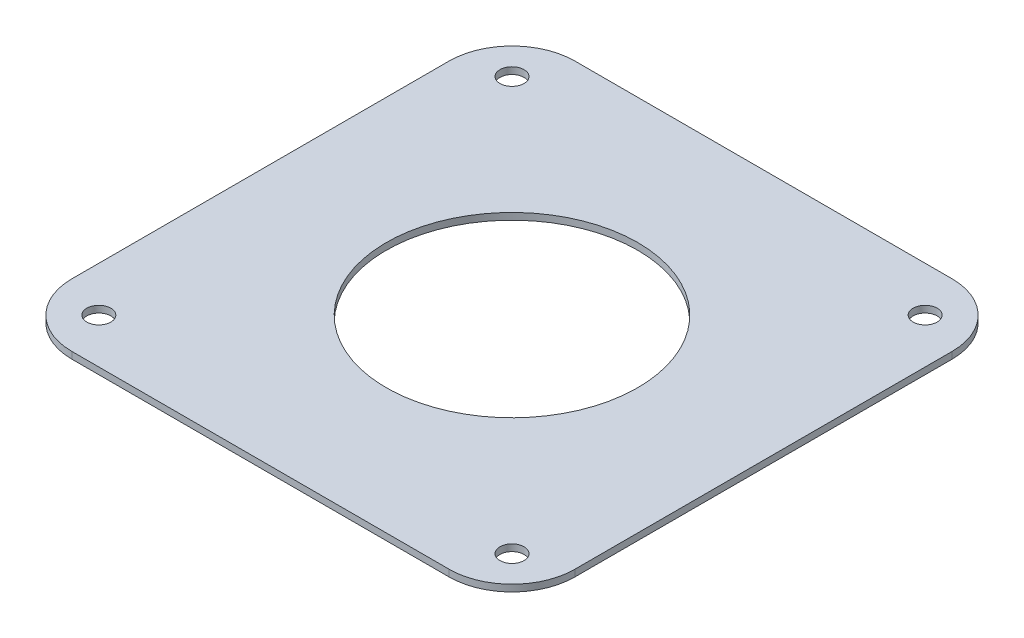
ISO-10303-21;
HEADER;
FILE_DESCRIPTION(('STEP AP214'),'2;1');
FILE_NAME('part.step','',(''),(''),'','','');
FILE_SCHEMA(('AUTOMOTIVE_DESIGN { 1 0 10303 214 1 1 1 1 }'));
ENDSEC;
DATA;
#1=APPLICATION_CONTEXT('core data for automotive mechanical design processes');
#2=APPLICATION_PROTOCOL_DEFINITION('international standard','automotive_design',2000,#1);
#3=PRODUCT_CONTEXT('',#1,'mechanical');
#4=PRODUCT('Part','Part','',(#3));
#5=PRODUCT_RELATED_PRODUCT_CATEGORY('part','',(#4));
#6=PRODUCT_DEFINITION_FORMATION('','',#4);
#7=PRODUCT_DEFINITION_CONTEXT('part definition',#1,'design');
#8=PRODUCT_DEFINITION('design','',#6,#7);
#9=PRODUCT_DEFINITION_SHAPE('','',#8);
#10=(LENGTH_UNIT() NAMED_UNIT(*) SI_UNIT(.MILLI.,.METRE.));
#11=(NAMED_UNIT(*) PLANE_ANGLE_UNIT() SI_UNIT($,.RADIAN.));
#12=(NAMED_UNIT(*) SI_UNIT($,.STERADIAN.) SOLID_ANGLE_UNIT());
#13=UNCERTAINTY_MEASURE_WITH_UNIT(LENGTH_MEASURE(1.E-05),#10,'distance_accuracy_value','');
#14=(GEOMETRIC_REPRESENTATION_CONTEXT(3) GLOBAL_UNCERTAINTY_ASSIGNED_CONTEXT((#13)) GLOBAL_UNIT_ASSIGNED_CONTEXT((#10,
#11,#12)) REPRESENTATION_CONTEXT('',''));
#15=CARTESIAN_POINT('',(0.,0.,0.));
#16=DIRECTION('',(0.,0.,1.));
#17=DIRECTION('',(1.,0.,0.));
#18=AXIS2_PLACEMENT_3D('',#15,#16,#17);
#19=CARTESIAN_POINT('',(0.,0.9525,0.));
#20=DIRECTION('',(0.,1.,0.));
#21=DIRECTION('',(0.,0.,1.));
#22=AXIS2_PLACEMENT_3D('',#19,#20,#21);
#23=PLANE('',#22);
#24=CARTESIAN_POINT('',(-29.21,0.9525,29.21));
#25=DIRECTION('',(0.,1.,0.));
#26=DIRECTION('',(0.,0.,1.));
#27=AXIS2_PLACEMENT_3D('',#24,#25,#26);
#28=CIRCLE('',#27,1.7);
#29=CARTESIAN_POINT('',(-29.21,0.9525,30.91));
#30=VERTEX_POINT('',#29);
#31=EDGE_CURVE('E203',#30,#30,#28,.T.);
#32=ORIENTED_EDGE('',*,*,#31,.F.);
#33=EDGE_LOOP('',(#32));
#34=FACE_BOUND('',#33,.T.);
#35=CARTESIAN_POINT('',(29.21,0.9525,29.21));
#36=DIRECTION('',(0.,1.,0.));
#37=DIRECTION('',(0.,0.,1.));
#38=AXIS2_PLACEMENT_3D('',#35,#36,#37);
#39=CIRCLE('',#38,1.7);
#40=CARTESIAN_POINT('',(29.21,0.9525,30.91));
#41=VERTEX_POINT('',#40);
#42=EDGE_CURVE('E197',#41,#41,#39,.T.);
#43=ORIENTED_EDGE('',*,*,#42,.F.);
#44=EDGE_LOOP('',(#43));
#45=FACE_BOUND('',#44,.T.);
#46=CARTESIAN_POINT('',(29.21,0.9525,-29.21));
#47=DIRECTION('',(0.,1.,0.));
#48=DIRECTION('',(0.,0.,1.));
#49=AXIS2_PLACEMENT_3D('',#46,#47,#48);
#50=CIRCLE('',#49,1.7);
#51=CARTESIAN_POINT('',(29.21,0.9525,-27.51));
#52=VERTEX_POINT('',#51);
#53=EDGE_CURVE('E191',#52,#52,#50,.T.);
#54=ORIENTED_EDGE('',*,*,#53,.F.);
#55=EDGE_LOOP('',(#54));
#56=FACE_BOUND('',#55,.T.);
#57=CARTESIAN_POINT('',(-29.21,0.9525,-29.21));
#58=DIRECTION('',(0.,1.,0.));
#59=DIRECTION('',(0.,0.,1.));
#60=AXIS2_PLACEMENT_3D('',#57,#58,#59);
#61=CIRCLE('',#60,1.7);
#62=CARTESIAN_POINT('',(-29.21,0.9525,-27.51));
#63=VERTEX_POINT('',#62);
#64=EDGE_CURVE('E185',#63,#63,#61,.T.);
#65=ORIENTED_EDGE('',*,*,#64,.F.);
#66=EDGE_LOOP('',(#65));
#67=FACE_BOUND('',#66,.T.);
#68=DIRECTION('',(0.,0.,-1.));
#69=VECTOR('',#68,1.);
#70=CARTESIAN_POINT('',(35.56,0.9525,-35.56));
#71=LINE('',#70,#69);
#72=CARTESIAN_POINT('',(35.56,0.9525,26.67));
#73=VERTEX_POINT('',#72);
#74=CARTESIAN_POINT('',(35.56,0.9525,-26.67));
#75=VERTEX_POINT('',#74);
#76=EDGE_CURVE('E137',#73,#75,#71,.T.);
#77=ORIENTED_EDGE('',*,*,#76,.T.);
#78=CARTESIAN_POINT('',(26.67,0.9525,-26.67));
#79=DIRECTION('',(0.,1.,0.));
#80=DIRECTION('',(0.,0.,1.));
#81=AXIS2_PLACEMENT_3D('',#78,#79,#80);
#82=CIRCLE('',#81,8.89);
#83=CARTESIAN_POINT('',(26.67,0.9525,-35.56));
#84=VERTEX_POINT('',#83);
#85=EDGE_CURVE('E152',#75,#84,#82,.T.);
#86=ORIENTED_EDGE('',*,*,#85,.T.);
#87=DIRECTION('',(-1.,0.,0.));
#88=VECTOR('',#87,1.);
#89=CARTESIAN_POINT('',(-35.56,0.9525,-35.56));
#90=LINE('',#89,#88);
#91=CARTESIAN_POINT('',(-26.67,0.9525,-35.56));
#92=VERTEX_POINT('',#91);
#93=EDGE_CURVE('E119',#84,#92,#90,.T.);
#94=ORIENTED_EDGE('',*,*,#93,.T.);
#95=CARTESIAN_POINT('',(-26.67,0.9525,-26.67));
#96=DIRECTION('',(0.,1.,0.));
#97=DIRECTION('',(0.,0.,1.));
#98=AXIS2_PLACEMENT_3D('',#95,#96,#97);
#99=CIRCLE('',#98,8.89);
#100=CARTESIAN_POINT('',(-35.56,0.9525,-26.67));
#101=VERTEX_POINT('',#100);
#102=EDGE_CURVE('E150',#92,#101,#99,.T.);
#103=ORIENTED_EDGE('',*,*,#102,.T.);
#104=DIRECTION('',(0.,0.,1.));
#105=VECTOR('',#104,1.);
#106=CARTESIAN_POINT('',(-35.56,0.9525,-35.56));
#107=LINE('',#106,#105);
#108=CARTESIAN_POINT('',(-35.56,0.9525,26.67));
#109=VERTEX_POINT('',#108);
#110=EDGE_CURVE('E163',#101,#109,#107,.T.);
#111=ORIENTED_EDGE('',*,*,#110,.T.);
#112=CARTESIAN_POINT('',(-26.67,0.9525,26.67));
#113=DIRECTION('',(0.,1.,0.));
#114=DIRECTION('',(0.,0.,1.));
#115=AXIS2_PLACEMENT_3D('',#112,#113,#114);
#116=CIRCLE('',#115,8.89);
#117=CARTESIAN_POINT('',(-26.67,0.9525,35.56));
#118=VERTEX_POINT('',#117);
#119=EDGE_CURVE('E54',#109,#118,#116,.T.);
#120=ORIENTED_EDGE('',*,*,#119,.T.);
#121=DIRECTION('',(1.,0.,0.));
#122=VECTOR('',#121,1.);
#123=CARTESIAN_POINT('',(-35.56,0.9525,35.56));
#124=LINE('',#123,#122);
#125=CARTESIAN_POINT('',(26.67,0.9525,35.56));
#126=VERTEX_POINT('',#125);
#127=EDGE_CURVE('E138',#118,#126,#124,.T.);
#128=ORIENTED_EDGE('',*,*,#127,.T.);
#129=CARTESIAN_POINT('',(26.67,0.9525,26.67));
#130=DIRECTION('',(0.,1.,0.));
#131=DIRECTION('',(0.,0.,1.));
#132=AXIS2_PLACEMENT_3D('',#129,#130,#131);
#133=CIRCLE('',#132,8.89);
#134=EDGE_CURVE('E147',#126,#73,#133,.T.);
#135=ORIENTED_EDGE('',*,*,#134,.T.);
#136=EDGE_LOOP('',(#77,#86,#94,#103,#111,#120,#128,#135));
#137=FACE_BOUND('',#136,.T.);
#138=CARTESIAN_POINT('',(0.,0.9525,0.));
#139=DIRECTION('',(0.,1.,0.));
#140=DIRECTION('',(0.,0.,1.));
#141=AXIS2_PLACEMENT_3D('',#138,#139,#140);
#142=CIRCLE('',#141,17.78);
#143=CARTESIAN_POINT('',(0.,0.9525,-17.78));
#144=VERTEX_POINT('',#143);
#145=EDGE_CURVE('E132',#144,#144,#142,.T.);
#146=ORIENTED_EDGE('',*,*,#145,.F.);
#147=EDGE_LOOP('',(#146));
#148=FACE_BOUND('',#147,.T.);
#149=ADVANCED_FACE('F33',(#34,#45,#56,#67,#137,#148),#23,.T.);
#150=CARTESIAN_POINT('',(0.,0.,0.));
#151=DIRECTION('',(0.,1.,0.));
#152=DIRECTION('',(0.,0.,1.));
#153=AXIS2_PLACEMENT_3D('',#150,#151,#152);
#154=PLANE('',#153);
#155=CARTESIAN_POINT('',(-29.21,0.,29.21));
#156=DIRECTION('',(0.,1.,0.));
#157=DIRECTION('',(0.,0.,1.));
#158=AXIS2_PLACEMENT_3D('',#155,#156,#157);
#159=CIRCLE('',#158,1.7);
#160=CARTESIAN_POINT('',(-29.21,0.,30.91));
#161=VERTEX_POINT('',#160);
#162=EDGE_CURVE('E200',#161,#161,#159,.T.);
#163=ORIENTED_EDGE('',*,*,#162,.T.);
#164=EDGE_LOOP('',(#163));
#165=FACE_BOUND('',#164,.T.);
#166=CARTESIAN_POINT('',(29.21,0.,29.21));
#167=DIRECTION('',(0.,1.,0.));
#168=DIRECTION('',(0.,0.,1.));
#169=AXIS2_PLACEMENT_3D('',#166,#167,#168);
#170=CIRCLE('',#169,1.7);
#171=CARTESIAN_POINT('',(29.21,0.,30.91));
#172=VERTEX_POINT('',#171);
#173=EDGE_CURVE('E194',#172,#172,#170,.T.);
#174=ORIENTED_EDGE('',*,*,#173,.T.);
#175=EDGE_LOOP('',(#174));
#176=FACE_BOUND('',#175,.T.);
#177=CARTESIAN_POINT('',(29.21,0.,-29.21));
#178=DIRECTION('',(0.,1.,0.));
#179=DIRECTION('',(0.,0.,1.));
#180=AXIS2_PLACEMENT_3D('',#177,#178,#179);
#181=CIRCLE('',#180,1.7);
#182=CARTESIAN_POINT('',(29.21,0.,-27.51));
#183=VERTEX_POINT('',#182);
#184=EDGE_CURVE('E188',#183,#183,#181,.T.);
#185=ORIENTED_EDGE('',*,*,#184,.T.);
#186=EDGE_LOOP('',(#185));
#187=FACE_BOUND('',#186,.T.);
#188=CARTESIAN_POINT('',(-29.21,0.,-29.21));
#189=DIRECTION('',(0.,1.,0.));
#190=DIRECTION('',(0.,0.,1.));
#191=AXIS2_PLACEMENT_3D('',#188,#189,#190);
#192=CIRCLE('',#191,1.7);
#193=CARTESIAN_POINT('',(-29.21,0.,-27.51));
#194=VERTEX_POINT('',#193);
#195=EDGE_CURVE('E180',#194,#194,#192,.T.);
#196=ORIENTED_EDGE('',*,*,#195,.T.);
#197=EDGE_LOOP('',(#196));
#198=FACE_BOUND('',#197,.T.);
#199=DIRECTION('',(-1.,0.,0.));
#200=VECTOR('',#199,1.);
#201=CARTESIAN_POINT('',(-35.56,0.,-35.56));
#202=LINE('',#201,#200);
#203=CARTESIAN_POINT('',(26.67,0.,-35.56));
#204=VERTEX_POINT('',#203);
#205=CARTESIAN_POINT('',(-26.67,0.,-35.56));
#206=VERTEX_POINT('',#205);
#207=EDGE_CURVE('E116',#204,#206,#202,.T.);
#208=ORIENTED_EDGE('',*,*,#207,.F.);
#209=CARTESIAN_POINT('',(26.67,0.,-26.67));
#210=DIRECTION('',(0.,1.,0.));
#211=DIRECTION('',(0.,0.,1.));
#212=AXIS2_PLACEMENT_3D('',#209,#210,#211);
#213=CIRCLE('',#212,8.89);
#214=CARTESIAN_POINT('',(35.56,0.,-26.67));
#215=VERTEX_POINT('',#214);
#216=EDGE_CURVE('E99',#204,#215,#213,.F.);
#217=ORIENTED_EDGE('',*,*,#216,.T.);
#218=DIRECTION('',(0.,0.,-1.));
#219=VECTOR('',#218,1.);
#220=CARTESIAN_POINT('',(35.56,0.,-35.56));
#221=LINE('',#220,#219);
#222=CARTESIAN_POINT('',(35.56,0.,26.67));
#223=VERTEX_POINT('',#222);
#224=EDGE_CURVE('E127',#223,#215,#221,.T.);
#225=ORIENTED_EDGE('',*,*,#224,.F.);
#226=CARTESIAN_POINT('',(26.67,0.,26.67));
#227=DIRECTION('',(0.,1.,0.));
#228=DIRECTION('',(0.,0.,1.));
#229=AXIS2_PLACEMENT_3D('',#226,#227,#228);
#230=CIRCLE('',#229,8.89);
#231=CARTESIAN_POINT('',(26.67,0.,35.56));
#232=VERTEX_POINT('',#231);
#233=EDGE_CURVE('E120',#223,#232,#230,.F.);
#234=ORIENTED_EDGE('',*,*,#233,.T.);
#235=DIRECTION('',(1.,0.,0.));
#236=VECTOR('',#235,1.);
#237=CARTESIAN_POINT('',(-35.56,0.,35.56));
#238=LINE('',#237,#236);
#239=CARTESIAN_POINT('',(-26.67,0.,35.56));
#240=VERTEX_POINT('',#239);
#241=EDGE_CURVE('E130',#240,#232,#238,.T.);
#242=ORIENTED_EDGE('',*,*,#241,.F.);
#243=CARTESIAN_POINT('',(-26.67,0.,26.67));
#244=DIRECTION('',(0.,1.,0.));
#245=DIRECTION('',(0.,0.,1.));
#246=AXIS2_PLACEMENT_3D('',#243,#244,#245);
#247=CIRCLE('',#246,8.89);
#248=CARTESIAN_POINT('',(-35.56,0.,26.67));
#249=VERTEX_POINT('',#248);
#250=EDGE_CURVE('E141',#240,#249,#247,.F.);
#251=ORIENTED_EDGE('',*,*,#250,.T.);
#252=DIRECTION('',(0.,0.,1.));
#253=VECTOR('',#252,1.);
#254=CARTESIAN_POINT('',(-35.56,0.,-35.56));
#255=LINE('',#254,#253);
#256=CARTESIAN_POINT('',(-35.56,0.,-26.67));
#257=VERTEX_POINT('',#256);
#258=EDGE_CURVE('E126',#257,#249,#255,.T.);
#259=ORIENTED_EDGE('',*,*,#258,.F.);
#260=CARTESIAN_POINT('',(-26.67,0.,-26.67));
#261=DIRECTION('',(0.,1.,0.));
#262=DIRECTION('',(0.,0.,1.));
#263=AXIS2_PLACEMENT_3D('',#260,#261,#262);
#264=CIRCLE('',#263,8.89);
#265=EDGE_CURVE('E110',#257,#206,#264,.F.);
#266=ORIENTED_EDGE('',*,*,#265,.T.);
#267=EDGE_LOOP('',(#208,#217,#225,#234,#242,#251,#259,#266));
#268=FACE_BOUND('',#267,.T.);
#269=CARTESIAN_POINT('',(0.,0.,0.));
#270=DIRECTION('',(0.,1.,0.));
#271=DIRECTION('',(0.,0.,1.));
#272=AXIS2_PLACEMENT_3D('',#269,#270,#271);
#273=CIRCLE('',#272,17.78);
#274=CARTESIAN_POINT('',(0.,0.,-17.78));
#275=VERTEX_POINT('',#274);
#276=EDGE_CURVE('E177',#275,#275,#273,.T.);
#277=ORIENTED_EDGE('',*,*,#276,.T.);
#278=EDGE_LOOP('',(#277));
#279=FACE_BOUND('',#278,.T.);
#280=ADVANCED_FACE('F123',(#165,#176,#187,#198,#268,#279),#154,.F.);
#281=CARTESIAN_POINT('',(35.56,0.9525,-35.56));
#282=DIRECTION('',(-1.,0.,0.));
#283=DIRECTION('',(0.,0.,1.));
#284=AXIS2_PLACEMENT_3D('',#281,#282,#283);
#285=PLANE('',#284);
#286=ORIENTED_EDGE('',*,*,#224,.T.);
#287=DIRECTION('',(0.,-1.,0.));
#288=VECTOR('',#287,1.);
#289=CARTESIAN_POINT('',(35.56,0.9525,-26.67));
#290=LINE('',#289,#288);
#291=EDGE_CURVE('E104',#215,#75,#290,.F.);
#292=ORIENTED_EDGE('',*,*,#291,.T.);
#293=ORIENTED_EDGE('',*,*,#76,.F.);
#294=DIRECTION('',(0.,-1.,0.));
#295=VECTOR('',#294,1.);
#296=CARTESIAN_POINT('',(35.56,0.9525,26.67));
#297=LINE('',#296,#295);
#298=EDGE_CURVE('E109',#73,#223,#297,.T.);
#299=ORIENTED_EDGE('',*,*,#298,.T.);
#300=EDGE_LOOP('',(#286,#292,#293,#299));
#301=FACE_BOUND('',#300,.T.);
#302=ADVANCED_FACE('F227',(#301),#285,.F.);
#303=CARTESIAN_POINT('',(-35.56,0.9525,-35.56));
#304=DIRECTION('',(0.,0.,1.));
#305=DIRECTION('',(1.,0.,0.));
#306=AXIS2_PLACEMENT_3D('',#303,#304,#305);
#307=PLANE('',#306);
#308=ORIENTED_EDGE('',*,*,#93,.F.);
#309=DIRECTION('',(0.,-1.,0.));
#310=VECTOR('',#309,1.);
#311=CARTESIAN_POINT('',(26.67,0.9525,-35.56));
#312=LINE('',#311,#310);
#313=EDGE_CURVE('E103',#84,#204,#312,.T.);
#314=ORIENTED_EDGE('',*,*,#313,.T.);
#315=ORIENTED_EDGE('',*,*,#207,.T.);
#316=DIRECTION('',(0.,-1.,0.));
#317=VECTOR('',#316,1.);
#318=CARTESIAN_POINT('',(-26.67,0.9525,-35.56));
#319=LINE('',#318,#317);
#320=EDGE_CURVE('E121',#206,#92,#319,.F.);
#321=ORIENTED_EDGE('',*,*,#320,.T.);
#322=EDGE_LOOP('',(#308,#314,#315,#321));
#323=FACE_BOUND('',#322,.T.);
#324=ADVANCED_FACE('F115',(#323),#307,.F.);
#325=CARTESIAN_POINT('',(-35.56,0.9525,-35.56));
#326=DIRECTION('',(1.,0.,0.));
#327=DIRECTION('',(0.,0.,-1.));
#328=AXIS2_PLACEMENT_3D('',#325,#326,#327);
#329=PLANE('',#328);
#330=ORIENTED_EDGE('',*,*,#110,.F.);
#331=DIRECTION('',(0.,-1.,0.));
#332=VECTOR('',#331,1.);
#333=CARTESIAN_POINT('',(-35.56,0.9525,-26.67));
#334=LINE('',#333,#332);
#335=EDGE_CURVE('E156',#101,#257,#334,.T.);
#336=ORIENTED_EDGE('',*,*,#335,.T.);
#337=ORIENTED_EDGE('',*,*,#258,.T.);
#338=DIRECTION('',(0.,-1.,0.));
#339=VECTOR('',#338,1.);
#340=CARTESIAN_POINT('',(-35.56,0.9525,26.67));
#341=LINE('',#340,#339);
#342=EDGE_CURVE('E154',#249,#109,#341,.F.);
#343=ORIENTED_EDGE('',*,*,#342,.T.);
#344=EDGE_LOOP('',(#330,#336,#337,#343));
#345=FACE_BOUND('',#344,.T.);
#346=ADVANCED_FACE('F161',(#345),#329,.F.);
#347=CARTESIAN_POINT('',(-35.56,0.9525,35.56));
#348=DIRECTION('',(0.,0.,-1.));
#349=DIRECTION('',(-1.,0.,0.));
#350=AXIS2_PLACEMENT_3D('',#347,#348,#349);
#351=PLANE('',#350);
#352=ORIENTED_EDGE('',*,*,#127,.F.);
#353=DIRECTION('',(0.,-1.,0.));
#354=VECTOR('',#353,1.);
#355=CARTESIAN_POINT('',(-26.67,0.9525,35.56));
#356=LINE('',#355,#354);
#357=EDGE_CURVE('E11',#118,#240,#356,.T.);
#358=ORIENTED_EDGE('',*,*,#357,.T.);
#359=ORIENTED_EDGE('',*,*,#241,.T.);
#360=DIRECTION('',(0.,-1.,0.));
#361=VECTOR('',#360,1.);
#362=CARTESIAN_POINT('',(26.67,0.9525,35.56));
#363=LINE('',#362,#361);
#364=EDGE_CURVE('E41',#232,#126,#363,.F.);
#365=ORIENTED_EDGE('',*,*,#364,.T.);
#366=EDGE_LOOP('',(#352,#358,#359,#365));
#367=FACE_BOUND('',#366,.T.);
#368=ADVANCED_FACE('F170',(#367),#351,.F.);
#369=CARTESIAN_POINT('',(0.,0.9525,0.));
#370=DIRECTION('',(0.,-1.,0.));
#371=DIRECTION('',(0.,0.,-1.));
#372=AXIS2_PLACEMENT_3D('',#369,#370,#371);
#373=CYLINDRICAL_SURFACE('',#372,17.78);
#374=CARTESIAN_POINT('',(0.,0.9525,-17.78));
#375=CARTESIAN_POINT('',(0.,0.942578125,-17.78));
#376=CARTESIAN_POINT('',(0.,0.93265625,-17.78));
#377=CARTESIAN_POINT('',(0.,0.9128125,-17.78));
#378=CARTESIAN_POINT('',(0.,0.902890625,-17.78));
#379=CARTESIAN_POINT('',(0.,0.883046875,-17.78));
#380=CARTESIAN_POINT('',(0.,0.873125,-17.78));
#381=CARTESIAN_POINT('',(0.,0.85328125,-17.78));
#382=CARTESIAN_POINT('',(0.,0.843359375,-17.78));
#383=CARTESIAN_POINT('',(0.,0.823515625,-17.78));
#384=CARTESIAN_POINT('',(0.,0.81359375,-17.78));
#385=CARTESIAN_POINT('',(0.,0.79375,-17.78));
#386=CARTESIAN_POINT('',(0.,0.783828125,-17.78));
#387=CARTESIAN_POINT('',(0.,0.763984375,-17.78));
#388=CARTESIAN_POINT('',(0.,0.7540625,-17.78));
#389=CARTESIAN_POINT('',(0.,0.73421875,-17.78));
#390=CARTESIAN_POINT('',(0.,0.724296875,-17.78));
#391=CARTESIAN_POINT('',(0.,0.704453125,-17.78));
#392=CARTESIAN_POINT('',(0.,0.69453125,-17.78));
#393=CARTESIAN_POINT('',(0.,0.6746875,-17.78));
#394=CARTESIAN_POINT('',(0.,0.664765625,-17.78));
#395=CARTESIAN_POINT('',(0.,0.644921875,-17.78));
#396=CARTESIAN_POINT('',(0.,0.635,-17.78));
#397=CARTESIAN_POINT('',(0.,0.61515625,-17.78));
#398=CARTESIAN_POINT('',(0.,0.605234375,-17.78));
#399=CARTESIAN_POINT('',(0.,0.585390625,-17.78));
#400=CARTESIAN_POINT('',(0.,0.57546875,-17.78));
#401=CARTESIAN_POINT('',(0.,0.555625,-17.78));
#402=CARTESIAN_POINT('',(0.,0.545703125,-17.78));
#403=CARTESIAN_POINT('',(0.,0.525859375,-17.78));
#404=CARTESIAN_POINT('',(0.,0.5159375,-17.78));
#405=CARTESIAN_POINT('',(0.,0.49609375,-17.78));
#406=CARTESIAN_POINT('',(0.,0.486171875,-17.78));
#407=CARTESIAN_POINT('',(0.,0.466328125,-17.78));
#408=CARTESIAN_POINT('',(0.,0.45640625,-17.78));
#409=CARTESIAN_POINT('',(0.,0.4365625,-17.78));
#410=CARTESIAN_POINT('',(0.,0.426640625,-17.78));
#411=CARTESIAN_POINT('',(0.,0.406796875,-17.78));
#412=CARTESIAN_POINT('',(0.,0.396875,-17.78));
#413=CARTESIAN_POINT('',(0.,0.37703125,-17.78));
#414=CARTESIAN_POINT('',(0.,0.367109375,-17.78));
#415=CARTESIAN_POINT('',(0.,0.347265625,-17.78));
#416=CARTESIAN_POINT('',(0.,0.33734375,-17.78));
#417=CARTESIAN_POINT('',(0.,0.3175,-17.78));
#418=CARTESIAN_POINT('',(0.,0.307578125,-17.78));
#419=CARTESIAN_POINT('',(0.,0.287734375,-17.78));
#420=CARTESIAN_POINT('',(0.,0.2778125,-17.78));
#421=CARTESIAN_POINT('',(0.,0.25796875,-17.78));
#422=CARTESIAN_POINT('',(0.,0.248046875,-17.78));
#423=CARTESIAN_POINT('',(0.,0.228203125,-17.78));
#424=CARTESIAN_POINT('',(0.,0.21828125,-17.78));
#425=CARTESIAN_POINT('',(0.,0.1984375,-17.78));
#426=CARTESIAN_POINT('',(0.,0.188515625,-17.78));
#427=CARTESIAN_POINT('',(0.,0.168671875,-17.78));
#428=CARTESIAN_POINT('',(0.,0.15875,-17.78));
#429=CARTESIAN_POINT('',(0.,0.13890625,-17.78));
#430=CARTESIAN_POINT('',(0.,0.128984375,-17.78));
#431=CARTESIAN_POINT('',(0.,0.109140625,-17.78));
#432=CARTESIAN_POINT('',(0.,0.09921875,-17.78));
#433=CARTESIAN_POINT('',(0.,0.079375,-17.78));
#434=CARTESIAN_POINT('',(0.,0.069453125,-17.78));
#435=CARTESIAN_POINT('',(0.,0.049609375,-17.78));
#436=CARTESIAN_POINT('',(0.,0.0396875,-17.78));
#437=CARTESIAN_POINT('',(0.,0.01984375,-17.78));
#438=CARTESIAN_POINT('',(0.,0.00992187499999998,-17.78));
#439=CARTESIAN_POINT('',(0.,0.,-17.78));
#440=B_SPLINE_CURVE_WITH_KNOTS('',3,(#374,#375,#376,#377,#378,#379,#380,#381,#382,#383,#384,
#385,#386,#387,#388,#389,#390,#391,#392,#393,#394,#395,#396,#397,#398,#399,#400,#401,#402,#403,
#404,#405,#406,#407,#408,#409,#410,#411,#412,#413,#414,#415,#416,#417,#418,#419,#420,#421,#422,
#423,#424,#425,#426,#427,#428,#429,#430,#431,#432,#433,#434,#435,#436,#437,#438,#439),
.UNSPECIFIED.,.F.,.F.,(4,2,2,2,2,2,2,2,2,2,2,2,2,2,2,2,2,2,2,2,2,2,2,2,2,2,2,2,2,2,2,2,4),(0.,
0.0297656250000001,0.05953125,0.0892968750000001,0.1190625,0.148828125,0.17859375,0.208359375,
0.238125,0.267890625,0.29765625,0.327421875,0.3571875,0.386953125,0.41671875,0.446484375,
0.47625,0.506015625,0.53578125,0.565546875,0.5953125,0.625078125,0.65484375,0.684609375,
0.714375,0.744140625,0.77390625,0.803671875,0.8334375,0.863203125,0.89296875,0.922734375,
0.9525),.UNSPECIFIED.);
#441=EDGE_CURVE('BSEAM221',#144,#275,#440,.T.);
#442=ORIENTED_EDGE('',*,*,#145,.T.);
#443=ORIENTED_EDGE('',*,*,#276,.F.);
#444=ORIENTED_EDGE('',*,*,#441,.T.);
#445=ORIENTED_EDGE('',*,*,#441,.F.);
#446=EDGE_LOOP('',(#442,#444,#443,#445));
#447=FACE_BOUND('',#446,.T.);
#448=ADVANCED_FACE('F221',(#447),#373,.F.);
#449=CARTESIAN_POINT('',(26.67,0.9525,-26.67));
#450=DIRECTION('',(0.,-1.,0.));
#451=DIRECTION('',(0.,0.,-1.));
#452=AXIS2_PLACEMENT_3D('',#449,#450,#451);
#453=CYLINDRICAL_SURFACE('',#452,8.89);
#454=ORIENTED_EDGE('',*,*,#85,.F.);
#455=ORIENTED_EDGE('',*,*,#291,.F.);
#456=ORIENTED_EDGE('',*,*,#216,.F.);
#457=ORIENTED_EDGE('',*,*,#313,.F.);
#458=EDGE_LOOP('',(#454,#455,#456,#457));
#459=FACE_BOUND('',#458,.T.);
#460=ADVANCED_FACE('F102',(#459),#453,.T.);
#461=CARTESIAN_POINT('',(-26.67,0.9525,-26.67));
#462=DIRECTION('',(0.,-1.,0.));
#463=DIRECTION('',(0.,0.,-1.));
#464=AXIS2_PLACEMENT_3D('',#461,#462,#463);
#465=CYLINDRICAL_SURFACE('',#464,8.89);
#466=ORIENTED_EDGE('',*,*,#102,.F.);
#467=ORIENTED_EDGE('',*,*,#320,.F.);
#468=ORIENTED_EDGE('',*,*,#265,.F.);
#469=ORIENTED_EDGE('',*,*,#335,.F.);
#470=EDGE_LOOP('',(#466,#467,#468,#469));
#471=FACE_BOUND('',#470,.T.);
#472=ADVANCED_FACE('F245',(#471),#465,.T.);
#473=CARTESIAN_POINT('',(-26.67,0.9525,26.67));
#474=DIRECTION('',(0.,-1.,0.));
#475=DIRECTION('',(0.,0.,-1.));
#476=AXIS2_PLACEMENT_3D('',#473,#474,#475);
#477=CYLINDRICAL_SURFACE('',#476,8.89);
#478=ORIENTED_EDGE('',*,*,#119,.F.);
#479=ORIENTED_EDGE('',*,*,#342,.F.);
#480=ORIENTED_EDGE('',*,*,#250,.F.);
#481=ORIENTED_EDGE('',*,*,#357,.F.);
#482=EDGE_LOOP('',(#478,#479,#480,#481));
#483=FACE_BOUND('',#482,.T.);
#484=ADVANCED_FACE('F169',(#483),#477,.T.);
#485=CARTESIAN_POINT('',(26.67,0.9525,26.67));
#486=DIRECTION('',(0.,-1.,0.));
#487=DIRECTION('',(0.,0.,-1.));
#488=AXIS2_PLACEMENT_3D('',#485,#486,#487);
#489=CYLINDRICAL_SURFACE('',#488,8.89);
#490=ORIENTED_EDGE('',*,*,#134,.F.);
#491=ORIENTED_EDGE('',*,*,#364,.F.);
#492=ORIENTED_EDGE('',*,*,#233,.F.);
#493=ORIENTED_EDGE('',*,*,#298,.F.);
#494=EDGE_LOOP('',(#490,#491,#492,#493));
#495=FACE_BOUND('',#494,.T.);
#496=ADVANCED_FACE('F35',(#495),#489,.T.);
#497=CARTESIAN_POINT('',(-29.21,0.9525,-29.21));
#498=DIRECTION('',(0.,1.,0.));
#499=DIRECTION('',(0.,0.,1.));
#500=AXIS2_PLACEMENT_3D('',#497,#498,#499);
#501=CYLINDRICAL_SURFACE('',#500,1.7);
#502=ORIENTED_EDGE('',*,*,#195,.F.);
#503=EDGE_LOOP('',(#502));
#504=FACE_BOUND('',#503,.T.);
#505=ORIENTED_EDGE('',*,*,#64,.T.);
#506=EDGE_LOOP('',(#505));
#507=FACE_BOUND('',#506,.T.);
#508=ADVANCED_FACE('F251',(#504,#507),#501,.F.);
#509=CARTESIAN_POINT('',(29.21,0.9525,-29.21));
#510=DIRECTION('',(0.,1.,0.));
#511=DIRECTION('',(0.,0.,1.));
#512=AXIS2_PLACEMENT_3D('',#509,#510,#511);
#513=CYLINDRICAL_SURFACE('',#512,1.7);
#514=ORIENTED_EDGE('',*,*,#184,.F.);
#515=EDGE_LOOP('',(#514));
#516=FACE_BOUND('',#515,.T.);
#517=ORIENTED_EDGE('',*,*,#53,.T.);
#518=EDGE_LOOP('',(#517));
#519=FACE_BOUND('',#518,.T.);
#520=ADVANCED_FACE('F256',(#516,#519),#513,.F.);
#521=CARTESIAN_POINT('',(29.21,0.9525,29.21));
#522=DIRECTION('',(0.,1.,0.));
#523=DIRECTION('',(0.,0.,1.));
#524=AXIS2_PLACEMENT_3D('',#521,#522,#523);
#525=CYLINDRICAL_SURFACE('',#524,1.7);
#526=ORIENTED_EDGE('',*,*,#173,.F.);
#527=EDGE_LOOP('',(#526));
#528=FACE_BOUND('',#527,.T.);
#529=ORIENTED_EDGE('',*,*,#42,.T.);
#530=EDGE_LOOP('',(#529));
#531=FACE_BOUND('',#530,.T.);
#532=ADVANCED_FACE('F263',(#528,#531),#525,.F.);
#533=CARTESIAN_POINT('',(-29.21,0.9525,29.21));
#534=DIRECTION('',(0.,1.,0.));
#535=DIRECTION('',(0.,0.,1.));
#536=AXIS2_PLACEMENT_3D('',#533,#534,#535);
#537=CYLINDRICAL_SURFACE('',#536,1.7);
#538=ORIENTED_EDGE('',*,*,#162,.F.);
#539=EDGE_LOOP('',(#538));
#540=FACE_BOUND('',#539,.T.);
#541=ORIENTED_EDGE('',*,*,#31,.T.);
#542=EDGE_LOOP('',(#541));
#543=FACE_BOUND('',#542,.T.);
#544=ADVANCED_FACE('F207',(#540,#543),#537,.F.);
#545=CLOSED_SHELL('',(#149,#280,#302,#324,#346,#368,#448,#460,#472,#484,#496,#508,#520,#532,#544));
#546=MANIFOLD_SOLID_BREP('B2',#545);
#547=ADVANCED_BREP_SHAPE_REPRESENTATION('',(#18,#546),#14);
#548=SHAPE_DEFINITION_REPRESENTATION(#9,#547);
ENDSEC;
END-ISO-10303-21;
